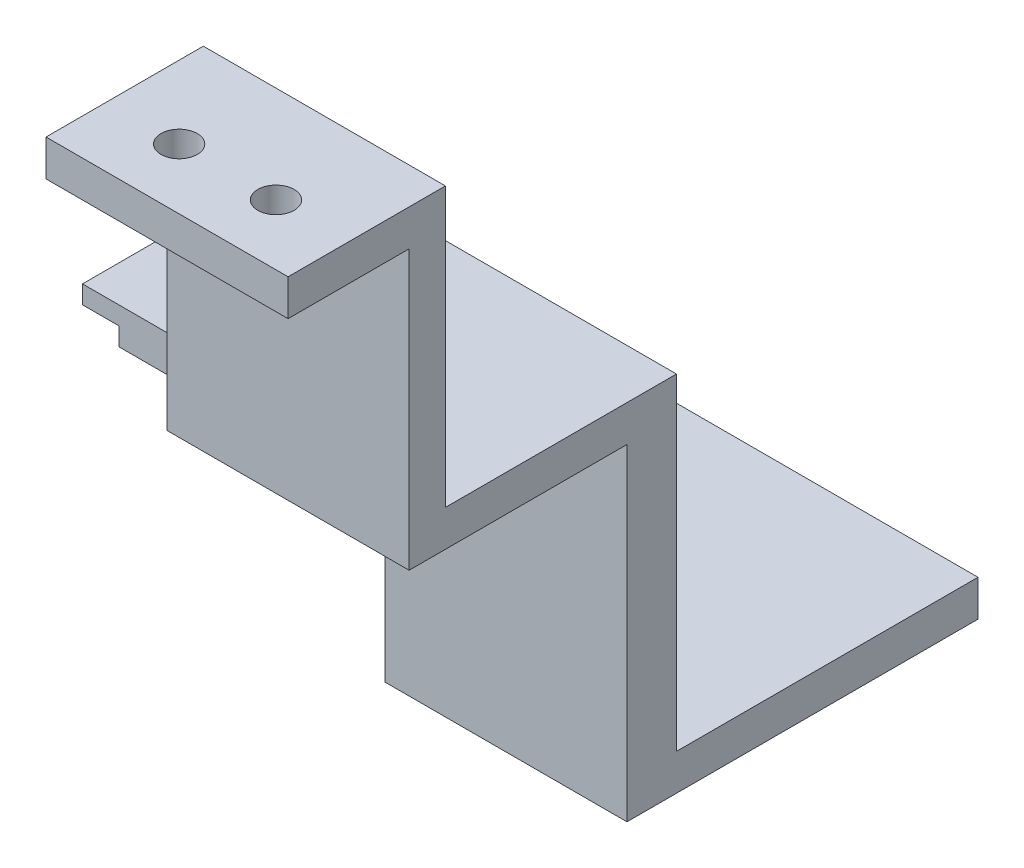
ISO-10303-21;
HEADER;
FILE_DESCRIPTION(('STEP AP214'),'2;1');
FILE_NAME('part.step','',(''),(''),'','','');
FILE_SCHEMA(('AUTOMOTIVE_DESIGN { 1 0 10303 214 1 1 1 1 }'));
ENDSEC;
DATA;
#1=APPLICATION_CONTEXT('core data for automotive mechanical design processes');
#2=APPLICATION_PROTOCOL_DEFINITION('international standard','automotive_design',2000,#1);
#3=PRODUCT_CONTEXT('',#1,'mechanical');
#4=PRODUCT('Part','Part','',(#3));
#5=PRODUCT_RELATED_PRODUCT_CATEGORY('part','',(#4));
#6=PRODUCT_DEFINITION_FORMATION('','',#4);
#7=PRODUCT_DEFINITION_CONTEXT('part definition',#1,'design');
#8=PRODUCT_DEFINITION('design','',#6,#7);
#9=PRODUCT_DEFINITION_SHAPE('','',#8);
#10=(LENGTH_UNIT() NAMED_UNIT(*) SI_UNIT(.MILLI.,.METRE.));
#11=(NAMED_UNIT(*) PLANE_ANGLE_UNIT() SI_UNIT($,.RADIAN.));
#12=(NAMED_UNIT(*) SI_UNIT($,.STERADIAN.) SOLID_ANGLE_UNIT());
#13=UNCERTAINTY_MEASURE_WITH_UNIT(LENGTH_MEASURE(1.E-05),#10,'distance_accuracy_value','');
#14=(GEOMETRIC_REPRESENTATION_CONTEXT(3) GLOBAL_UNCERTAINTY_ASSIGNED_CONTEXT((#13)) GLOBAL_UNIT_ASSIGNED_CONTEXT((#10,
#11,#12)) REPRESENTATION_CONTEXT('',''));
#15=CARTESIAN_POINT('',(0.,0.,0.));
#16=DIRECTION('',(0.,0.,1.));
#17=DIRECTION('',(1.,0.,0.));
#18=AXIS2_PLACEMENT_3D('',#15,#16,#17);
#19=CARTESIAN_POINT('',(9.99999999999999,-50.,-23.));
#20=DIRECTION('',(0.,-1.,0.));
#21=DIRECTION('',(0.,0.,-1.));
#22=AXIS2_PLACEMENT_3D('',#19,#20,#21);
#23=PLANE('',#22);
#24=DIRECTION('',(-1.,0.,0.));
#25=VECTOR('',#24,1.);
#26=CARTESIAN_POINT('',(-45.9839745962156,-50.,-36.));
#27=LINE('',#26,#25);
#28=CARTESIAN_POINT('',(-10.,-50.,-36.));
#29=VERTEX_POINT('',#28);
#30=CARTESIAN_POINT('',(-44.9839745962156,-50.,-36.));
#31=VERTEX_POINT('',#30);
#32=EDGE_CURVE('E184',#29,#31,#27,.T.);
#33=ORIENTED_EDGE('',*,*,#32,.T.);
#34=DIRECTION('',(0.,0.,1.));
#35=VECTOR('',#34,1.);
#36=CARTESIAN_POINT('',(-44.9839745962156,-50.,-52.));
#37=LINE('',#36,#35);
#38=CARTESIAN_POINT('',(-44.9839745962156,-50.,-52.));
#39=VERTEX_POINT('',#38);
#40=EDGE_CURVE('E172',#39,#31,#37,.T.);
#41=ORIENTED_EDGE('',*,*,#40,.F.);
#42=DIRECTION('',(1.,0.,0.));
#43=VECTOR('',#42,1.);
#44=CARTESIAN_POINT('',(-45.9839745962156,-50.,-52.));
#45=LINE('',#44,#43);
#46=CARTESIAN_POINT('',(9.99999999999996,-50.,-52.));
#47=VERTEX_POINT('',#46);
#48=EDGE_CURVE('E180',#39,#47,#45,.T.);
#49=ORIENTED_EDGE('',*,*,#48,.T.);
#50=DIRECTION('',(0.,0.,1.));
#51=VECTOR('',#50,1.);
#52=CARTESIAN_POINT('',(9.99999999999999,-50.,-23.));
#53=LINE('',#52,#51);
#54=CARTESIAN_POINT('',(9.99999999999999,-50.,-23.));
#55=VERTEX_POINT('',#54);
#56=EDGE_CURVE('E222',#47,#55,#53,.T.);
#57=ORIENTED_EDGE('',*,*,#56,.T.);
#58=DIRECTION('',(-1.,0.,0.));
#59=VECTOR('',#58,1.);
#60=CARTESIAN_POINT('',(9.99999999999999,-50.,-23.));
#61=LINE('',#60,#59);
#62=CARTESIAN_POINT('',(-10.,-50.,-23.));
#63=VERTEX_POINT('',#62);
#64=EDGE_CURVE('E257',#55,#63,#61,.T.);
#65=ORIENTED_EDGE('',*,*,#64,.T.);
#66=DIRECTION('',(0.,0.,1.));
#67=VECTOR('',#66,1.);
#68=CARTESIAN_POINT('',(-10.,-50.,-23.));
#69=LINE('',#68,#67);
#70=EDGE_CURVE('E243',#29,#63,#69,.T.);
#71=ORIENTED_EDGE('',*,*,#70,.F.);
#72=EDGE_LOOP('',(#33,#41,#49,#57,#65,#71));
#73=FACE_BOUND('',#72,.T.);
#74=ADVANCED_FACE('F35',(#73),#23,.T.);
#75=CARTESIAN_POINT('',(9.99999999999999,-47.,-44.));
#76=DIRECTION('',(0.,1.,0.));
#77=DIRECTION('',(0.,0.,1.));
#78=AXIS2_PLACEMENT_3D('',#75,#76,#77);
#79=PLANE('',#78);
#80=DIRECTION('',(1.,0.,0.));
#81=VECTOR('',#80,1.);
#82=CARTESIAN_POINT('',(-45.9839745962156,-47.,-52.));
#83=LINE('',#82,#81);
#84=CARTESIAN_POINT('',(-47.9839745962156,-47.,-52.));
#85=VERTEX_POINT('',#84);
#86=CARTESIAN_POINT('',(9.99999999999996,-47.,-52.));
#87=VERTEX_POINT('',#86);
#88=EDGE_CURVE('E181',#85,#87,#83,.T.);
#89=ORIENTED_EDGE('',*,*,#88,.F.);
#90=DIRECTION('',(0.,0.,-1.));
#91=VECTOR('',#90,1.);
#92=CARTESIAN_POINT('',(-47.9839745962156,-47.,-52.));
#93=LINE('',#92,#91);
#94=CARTESIAN_POINT('',(-47.9839745962156,-47.,-36.));
#95=VERTEX_POINT('',#94);
#96=EDGE_CURVE('E165',#95,#85,#93,.T.);
#97=ORIENTED_EDGE('',*,*,#96,.F.);
#98=DIRECTION('',(-1.,0.,0.));
#99=VECTOR('',#98,1.);
#100=CARTESIAN_POINT('',(-45.9839745962156,-47.,-36.));
#101=LINE('',#100,#99);
#102=CARTESIAN_POINT('',(-10.,-47.,-36.));
#103=VERTEX_POINT('',#102);
#104=EDGE_CURVE('E183',#103,#95,#101,.T.);
#105=ORIENTED_EDGE('',*,*,#104,.F.);
#106=DIRECTION('',(0.,0.,-1.));
#107=VECTOR('',#106,1.);
#108=CARTESIAN_POINT('',(-10.,-47.,-44.));
#109=LINE('',#108,#107);
#110=CARTESIAN_POINT('',(-10.,-47.,-27.0877784990879));
#111=VERTEX_POINT('',#110);
#112=EDGE_CURVE('E241',#111,#103,#109,.T.);
#113=ORIENTED_EDGE('',*,*,#112,.F.);
#114=DIRECTION('',(-1.,0.,0.));
#115=VECTOR('',#114,1.);
#116=CARTESIAN_POINT('',(9.99999999999999,-47.,-27.0877784990879));
#117=LINE('',#116,#115);
#118=CARTESIAN_POINT('',(9.99999999999999,-47.,-27.0877784990879));
#119=VERTEX_POINT('',#118);
#120=EDGE_CURVE('E260',#119,#111,#117,.T.);
#121=ORIENTED_EDGE('',*,*,#120,.F.);
#122=DIRECTION('',(0.,0.,-1.));
#123=VECTOR('',#122,1.);
#124=CARTESIAN_POINT('',(9.99999999999999,-47.,-44.));
#125=LINE('',#124,#123);
#126=EDGE_CURVE('E219',#119,#87,#125,.T.);
#127=ORIENTED_EDGE('',*,*,#126,.T.);
#128=EDGE_LOOP('',(#89,#97,#105,#113,#121,#127));
#129=FACE_BOUND('',#128,.T.);
#130=ADVANCED_FACE('F312',(#129),#79,.T.);
#131=CARTESIAN_POINT('',(-45.9839745962156,-47.,-36.));
#132=DIRECTION('',(0.,0.,1.));
#133=DIRECTION('',(1.,0.,0.));
#134=AXIS2_PLACEMENT_3D('',#131,#132,#133);
#135=PLANE('',#134);
#136=ORIENTED_EDGE('',*,*,#104,.T.);
#137=DIRECTION('',(0.,1.,0.));
#138=VECTOR('',#137,1.);
#139=CARTESIAN_POINT('',(-47.9839745962156,-47.,-36.));
#140=LINE('',#139,#138);
#141=CARTESIAN_POINT('',(-47.9839745962156,-48.5,-36.));
#142=VERTEX_POINT('',#141);
#143=EDGE_CURVE('E158',#142,#95,#140,.T.);
#144=ORIENTED_EDGE('',*,*,#143,.F.);
#145=DIRECTION('',(1.,0.,0.));
#146=VECTOR('',#145,1.);
#147=CARTESIAN_POINT('',(-47.9839745962156,-48.5,-36.));
#148=LINE('',#147,#146);
#149=CARTESIAN_POINT('',(-44.9839745962156,-48.5,-36.));
#150=VERTEX_POINT('',#149);
#151=EDGE_CURVE('E154',#142,#150,#148,.T.);
#152=ORIENTED_EDGE('',*,*,#151,.T.);
#153=DIRECTION('',(0.,1.,0.));
#154=VECTOR('',#153,1.);
#155=CARTESIAN_POINT('',(-44.9839745962156,-47.,-36.));
#156=LINE('',#155,#154);
#157=EDGE_CURVE('E178',#31,#150,#156,.T.);
#158=ORIENTED_EDGE('',*,*,#157,.F.);
#159=ORIENTED_EDGE('',*,*,#32,.F.);
#160=DIRECTION('',(0.,-1.,0.));
#161=VECTOR('',#160,1.);
#162=CARTESIAN_POINT('',(-10.,3.,-36.));
#163=LINE('',#162,#161);
#164=EDGE_CURVE('E58',#103,#29,#163,.T.);
#165=ORIENTED_EDGE('',*,*,#164,.F.);
#166=EDGE_LOOP('',(#136,#144,#152,#158,#159,#165));
#167=FACE_BOUND('',#166,.T.);
#168=ADVANCED_FACE('F332',(#167),#135,.T.);
#169=CARTESIAN_POINT('',(-45.9839745962156,-47.,-52.));
#170=DIRECTION('',(0.,0.,-1.));
#171=DIRECTION('',(-1.,0.,0.));
#172=AXIS2_PLACEMENT_3D('',#169,#170,#171);
#173=PLANE('',#172);
#174=ORIENTED_EDGE('',*,*,#48,.F.);
#175=DIRECTION('',(0.,-1.,0.));
#176=VECTOR('',#175,1.);
#177=CARTESIAN_POINT('',(-44.9839745962156,-47.,-52.));
#178=LINE('',#177,#176);
#179=CARTESIAN_POINT('',(-44.9839745962156,-48.5,-52.));
#180=VERTEX_POINT('',#179);
#181=EDGE_CURVE('E170',#180,#39,#178,.T.);
#182=ORIENTED_EDGE('',*,*,#181,.F.);
#183=DIRECTION('',(1.,0.,0.));
#184=VECTOR('',#183,1.);
#185=CARTESIAN_POINT('',(-47.9839745962156,-48.5,-52.));
#186=LINE('',#185,#184);
#187=CARTESIAN_POINT('',(-47.9839745962156,-48.5,-52.));
#188=VERTEX_POINT('',#187);
#189=EDGE_CURVE('E152',#188,#180,#186,.T.);
#190=ORIENTED_EDGE('',*,*,#189,.F.);
#191=DIRECTION('',(0.,-1.,0.));
#192=VECTOR('',#191,1.);
#193=CARTESIAN_POINT('',(-47.9839745962156,-47.,-52.));
#194=LINE('',#193,#192);
#195=EDGE_CURVE('E159',#85,#188,#194,.T.);
#196=ORIENTED_EDGE('',*,*,#195,.F.);
#197=ORIENTED_EDGE('',*,*,#88,.T.);
#198=DIRECTION('',(0.,-1.,0.));
#199=VECTOR('',#198,1.);
#200=CARTESIAN_POINT('',(9.99999999999996,-47.,-52.));
#201=LINE('',#200,#199);
#202=EDGE_CURVE('E186',#87,#47,#201,.T.);
#203=ORIENTED_EDGE('',*,*,#202,.T.);
#204=EDGE_LOOP('',(#174,#182,#190,#196,#197,#203));
#205=FACE_BOUND('',#204,.T.);
#206=ADVANCED_FACE('F169',(#205),#173,.T.);
#207=CARTESIAN_POINT('',(9.99999999999999,3.,-5.));
#208=DIRECTION('',(-1.,0.,0.));
#209=DIRECTION('',(0.,0.,1.));
#210=AXIS2_PLACEMENT_3D('',#207,#208,#209);
#211=PLANE('',#210);
#212=DIRECTION('',(0.,1.,0.));
#213=VECTOR('',#212,1.);
#214=CARTESIAN_POINT('',(9.99999999999999,-23.0000000000001,-23.));
#215=LINE('',#214,#213);
#216=CARTESIAN_POINT('',(9.99999999999999,-23.0000000000001,-23.));
#217=VERTEX_POINT('',#216);
#218=EDGE_CURVE('E224',#55,#217,#215,.T.);
#219=ORIENTED_EDGE('',*,*,#218,.F.);
#220=ORIENTED_EDGE('',*,*,#56,.F.);
#221=ORIENTED_EDGE('',*,*,#202,.F.);
#222=ORIENTED_EDGE('',*,*,#126,.F.);
#223=DIRECTION('',(0.,-1.,0.));
#224=VECTOR('',#223,1.);
#225=CARTESIAN_POINT('',(9.99999999999999,-20.0000000000001,-27.0877784990879));
#226=LINE('',#225,#224);
#227=CARTESIAN_POINT('',(9.99999999999999,-20.0000000000001,-27.0877784990879));
#228=VERTEX_POINT('',#227);
#229=EDGE_CURVE('E216',#228,#119,#226,.T.);
#230=ORIENTED_EDGE('',*,*,#229,.F.);
#231=DIRECTION('',(0.,0.,-1.));
#232=VECTOR('',#231,1.);
#233=CARTESIAN_POINT('',(9.99999999999999,-20.0000000000001,-27.0877784990879));
#234=LINE('',#233,#232);
#235=CARTESIAN_POINT('',(9.99999999999999,-20.0000000000001,-8.00000000002824));
#236=VERTEX_POINT('',#235);
#237=EDGE_CURVE('E213',#236,#228,#234,.T.);
#238=ORIENTED_EDGE('',*,*,#237,.F.);
#239=DIRECTION('',(0.,-1.,0.));
#240=VECTOR('',#239,1.);
#241=CARTESIAN_POINT('',(9.99999999999999,-20.0000000000001,-8.00000000002824));
#242=LINE('',#241,#240);
#243=CARTESIAN_POINT('',(9.99999999999999,2.99999999999989,-8.00000000002824));
#244=VERTEX_POINT('',#243);
#245=EDGE_CURVE('E209',#244,#236,#242,.T.);
#246=ORIENTED_EDGE('',*,*,#245,.F.);
#247=DIRECTION('',(0.,0.,-1.));
#248=VECTOR('',#247,1.);
#249=CARTESIAN_POINT('',(9.99999999999999,3.,-5.));
#250=LINE('',#249,#248);
#251=CARTESIAN_POINT('',(10.,3.,5.));
#252=VERTEX_POINT('',#251);
#253=EDGE_CURVE('E268',#252,#244,#250,.T.);
#254=ORIENTED_EDGE('',*,*,#253,.F.);
#255=DIRECTION('',(0.,-1.,0.));
#256=VECTOR('',#255,1.);
#257=CARTESIAN_POINT('',(10.,3.,5.));
#258=LINE('',#257,#256);
#259=CARTESIAN_POINT('',(10.,0.,5.));
#260=VERTEX_POINT('',#259);
#261=EDGE_CURVE('E43',#252,#260,#258,.T.);
#262=ORIENTED_EDGE('',*,*,#261,.T.);
#263=DIRECTION('',(0.,0.,-1.));
#264=VECTOR('',#263,1.);
#265=CARTESIAN_POINT('',(9.99999999999999,0.,-5.));
#266=LINE('',#265,#264);
#267=CARTESIAN_POINT('',(9.99999999999999,0.,-5.));
#268=VERTEX_POINT('',#267);
#269=EDGE_CURVE('E253',#260,#268,#266,.T.);
#270=ORIENTED_EDGE('',*,*,#269,.T.);
#271=DIRECTION('',(0.,1.,0.));
#272=VECTOR('',#271,1.);
#273=CARTESIAN_POINT('',(9.99999999999999,-23.0000000000001,-5.));
#274=LINE('',#273,#272);
#275=CARTESIAN_POINT('',(9.99999999999999,-23.0000000000001,-5.));
#276=VERTEX_POINT('',#275);
#277=EDGE_CURVE('E206',#276,#268,#274,.T.);
#278=ORIENTED_EDGE('',*,*,#277,.F.);
#279=DIRECTION('',(0.,0.,1.));
#280=VECTOR('',#279,1.);
#281=CARTESIAN_POINT('',(9.99999999999999,-23.0000000000001,-8.00000000002819));
#282=LINE('',#281,#280);
#283=EDGE_CURVE('E227',#217,#276,#282,.T.);
#284=ORIENTED_EDGE('',*,*,#283,.F.);
#285=EDGE_LOOP('',(#219,#220,#221,#222,#230,#238,#246,#254,#262,#270,#278,#284));
#286=FACE_BOUND('',#285,.T.);
#287=ADVANCED_FACE('F37',(#286),#211,.F.);
#288=CARTESIAN_POINT('',(-10.,3.,-5.));
#289=DIRECTION('',(1.,0.,0.));
#290=DIRECTION('',(0.,0.,-1.));
#291=AXIS2_PLACEMENT_3D('',#288,#289,#290);
#292=PLANE('',#291);
#293=ORIENTED_EDGE('',*,*,#112,.T.);
#294=ORIENTED_EDGE('',*,*,#164,.T.);
#295=ORIENTED_EDGE('',*,*,#70,.T.);
#296=DIRECTION('',(0.,1.,0.));
#297=VECTOR('',#296,1.);
#298=CARTESIAN_POINT('',(-10.,-23.0000000000001,-23.));
#299=LINE('',#298,#297);
#300=CARTESIAN_POINT('',(-10.,-23.0000000000001,-23.));
#301=VERTEX_POINT('',#300);
#302=EDGE_CURVE('E245',#63,#301,#299,.T.);
#303=ORIENTED_EDGE('',*,*,#302,.T.);
#304=DIRECTION('',(0.,0.,1.));
#305=VECTOR('',#304,1.);
#306=CARTESIAN_POINT('',(-10.,-23.0000000000001,-8.00000000002819));
#307=LINE('',#306,#305);
#308=CARTESIAN_POINT('',(-10.,-23.0000000000001,-5.));
#309=VERTEX_POINT('',#308);
#310=EDGE_CURVE('E210',#301,#309,#307,.T.);
#311=ORIENTED_EDGE('',*,*,#310,.T.);
#312=DIRECTION('',(0.,1.,0.));
#313=VECTOR('',#312,1.);
#314=CARTESIAN_POINT('',(-10.,3.,-5.));
#315=LINE('',#314,#313);
#316=CARTESIAN_POINT('',(-10.,0.,-5.));
#317=VERTEX_POINT('',#316);
#318=EDGE_CURVE('E201',#309,#317,#315,.T.);
#319=ORIENTED_EDGE('',*,*,#318,.T.);
#320=DIRECTION('',(0.,0.,1.));
#321=VECTOR('',#320,1.);
#322=CARTESIAN_POINT('',(-10.,0.,-5.));
#323=LINE('',#322,#321);
#324=CARTESIAN_POINT('',(-10.,0.,5.));
#325=VERTEX_POINT('',#324);
#326=EDGE_CURVE('E280',#317,#325,#323,.T.);
#327=ORIENTED_EDGE('',*,*,#326,.T.);
#328=DIRECTION('',(0.,-1.,0.));
#329=VECTOR('',#328,1.);
#330=CARTESIAN_POINT('',(-10.,3.,5.));
#331=LINE('',#330,#329);
#332=CARTESIAN_POINT('',(-10.,3.,5.));
#333=VERTEX_POINT('',#332);
#334=EDGE_CURVE('E11',#333,#325,#331,.T.);
#335=ORIENTED_EDGE('',*,*,#334,.F.);
#336=DIRECTION('',(0.,0.,1.));
#337=VECTOR('',#336,1.);
#338=CARTESIAN_POINT('',(-10.,3.,-5.));
#339=LINE('',#338,#337);
#340=CARTESIAN_POINT('',(-10.,2.99999999999989,-8.00000000002823));
#341=VERTEX_POINT('',#340);
#342=EDGE_CURVE('E270',#341,#333,#339,.T.);
#343=ORIENTED_EDGE('',*,*,#342,.F.);
#344=DIRECTION('',(0.,-1.,0.));
#345=VECTOR('',#344,1.);
#346=CARTESIAN_POINT('',(-10.,-20.0000000000001,-8.00000000002823));
#347=LINE('',#346,#345);
#348=CARTESIAN_POINT('',(-10.,-20.0000000000001,-8.00000000002823));
#349=VERTEX_POINT('',#348);
#350=EDGE_CURVE('E232',#341,#349,#347,.T.);
#351=ORIENTED_EDGE('',*,*,#350,.T.);
#352=DIRECTION('',(0.,0.,-1.));
#353=VECTOR('',#352,1.);
#354=CARTESIAN_POINT('',(-10.,-20.0000000000001,-27.0877784990879));
#355=LINE('',#354,#353);
#356=CARTESIAN_POINT('',(-10.,-20.0000000000001,-27.0877784990879));
#357=VERTEX_POINT('',#356);
#358=EDGE_CURVE('E235',#349,#357,#355,.T.);
#359=ORIENTED_EDGE('',*,*,#358,.T.);
#360=DIRECTION('',(0.,-1.,0.));
#361=VECTOR('',#360,1.);
#362=CARTESIAN_POINT('',(-10.,-20.0000000000001,-27.0877784990879));
#363=LINE('',#362,#361);
#364=EDGE_CURVE('E238',#357,#111,#363,.T.);
#365=ORIENTED_EDGE('',*,*,#364,.T.);
#366=EDGE_LOOP('',(#293,#294,#295,#303,#311,#319,#327,#335,#343,#351,#359,#365));
#367=FACE_BOUND('',#366,.T.);
#368=ADVANCED_FACE('F298',(#367),#292,.F.);
#369=CARTESIAN_POINT('',(-10.,3.,5.));
#370=DIRECTION('',(0.,0.,-1.));
#371=DIRECTION('',(-1.,0.,0.));
#372=AXIS2_PLACEMENT_3D('',#369,#370,#371);
#373=PLANE('',#372);
#374=DIRECTION('',(1.,0.,0.));
#375=VECTOR('',#374,1.);
#376=CARTESIAN_POINT('',(-10.,0.,5.));
#377=LINE('',#376,#375);
#378=EDGE_CURVE('E271',#325,#260,#377,.T.);
#379=ORIENTED_EDGE('',*,*,#378,.T.);
#380=ORIENTED_EDGE('',*,*,#261,.F.);
#381=DIRECTION('',(1.,0.,0.));
#382=VECTOR('',#381,1.);
#383=CARTESIAN_POINT('',(-10.,3.,5.));
#384=LINE('',#383,#382);
#385=EDGE_CURVE('E273',#333,#252,#384,.T.);
#386=ORIENTED_EDGE('',*,*,#385,.F.);
#387=ORIENTED_EDGE('',*,*,#334,.T.);
#388=EDGE_LOOP('',(#379,#380,#386,#387));
#389=FACE_BOUND('',#388,.T.);
#390=ADVANCED_FACE('F328',(#389),#373,.F.);
#391=CARTESIAN_POINT('',(0.,3.,0.));
#392=DIRECTION('',(0.,1.,0.));
#393=DIRECTION('',(0.,0.,1.));
#394=AXIS2_PLACEMENT_3D('',#391,#392,#393);
#395=PLANE('',#394);
#396=CARTESIAN_POINT('',(4.,3.,0.));
#397=DIRECTION('',(0.,1.,0.));
#398=DIRECTION('',(0.,0.,1.));
#399=AXIS2_PLACEMENT_3D('',#396,#397,#398);
#400=CIRCLE('',#399,1.5);
#401=CARTESIAN_POINT('',(4.,3.,1.5));
#402=VERTEX_POINT('',#401);
#403=EDGE_CURVE('E194',#402,#402,#400,.T.);
#404=ORIENTED_EDGE('',*,*,#403,.F.);
#405=EDGE_LOOP('',(#404));
#406=FACE_BOUND('',#405,.T.);
#407=CARTESIAN_POINT('',(-4.,3.,0.));
#408=DIRECTION('',(0.,1.,0.));
#409=DIRECTION('',(0.,0.,1.));
#410=AXIS2_PLACEMENT_3D('',#407,#408,#409);
#411=CIRCLE('',#410,1.5);
#412=CARTESIAN_POINT('',(-4.,3.,1.5));
#413=VERTEX_POINT('',#412);
#414=EDGE_CURVE('E193',#413,#413,#411,.T.);
#415=ORIENTED_EDGE('',*,*,#414,.F.);
#416=EDGE_LOOP('',(#415));
#417=FACE_BOUND('',#416,.T.);
#418=ORIENTED_EDGE('',*,*,#253,.T.);
#419=DIRECTION('',(-1.,0.,0.));
#420=VECTOR('',#419,1.);
#421=CARTESIAN_POINT('',(9.99999999999999,2.99999999999989,-8.00000000002824));
#422=LINE('',#421,#420);
#423=EDGE_CURVE('E229',#244,#341,#422,.T.);
#424=ORIENTED_EDGE('',*,*,#423,.T.);
#425=ORIENTED_EDGE('',*,*,#342,.T.);
#426=ORIENTED_EDGE('',*,*,#385,.T.);
#427=EDGE_LOOP('',(#418,#424,#425,#426));
#428=FACE_BOUND('',#427,.T.);
#429=ADVANCED_FACE('F327',(#406,#417,#428),#395,.T.);
#430=CARTESIAN_POINT('',(0.,0.,0.));
#431=DIRECTION('',(0.,1.,0.));
#432=DIRECTION('',(0.,0.,1.));
#433=AXIS2_PLACEMENT_3D('',#430,#431,#432);
#434=PLANE('',#433);
#435=CARTESIAN_POINT('',(4.,0.,0.));
#436=DIRECTION('',(0.,1.,0.));
#437=DIRECTION('',(0.,0.,1.));
#438=AXIS2_PLACEMENT_3D('',#435,#436,#437);
#439=CIRCLE('',#438,1.5);
#440=CARTESIAN_POINT('',(4.,0.,1.5));
#441=VERTEX_POINT('',#440);
#442=EDGE_CURVE('E197',#441,#441,#439,.F.);
#443=ORIENTED_EDGE('',*,*,#442,.F.);
#444=EDGE_LOOP('',(#443));
#445=FACE_BOUND('',#444,.T.);
#446=CARTESIAN_POINT('',(-4.,0.,0.));
#447=DIRECTION('',(0.,1.,0.));
#448=DIRECTION('',(0.,0.,1.));
#449=AXIS2_PLACEMENT_3D('',#446,#447,#448);
#450=CIRCLE('',#449,1.5);
#451=CARTESIAN_POINT('',(-4.,0.,1.5));
#452=VERTEX_POINT('',#451);
#453=EDGE_CURVE('E198',#452,#452,#450,.F.);
#454=ORIENTED_EDGE('',*,*,#453,.F.);
#455=EDGE_LOOP('',(#454));
#456=FACE_BOUND('',#455,.T.);
#457=ORIENTED_EDGE('',*,*,#269,.F.);
#458=ORIENTED_EDGE('',*,*,#378,.F.);
#459=ORIENTED_EDGE('',*,*,#326,.F.);
#460=DIRECTION('',(-1.,0.,0.));
#461=VECTOR('',#460,1.);
#462=CARTESIAN_POINT('',(-10.,0.,-5.));
#463=LINE('',#462,#461);
#464=EDGE_CURVE('E277',#268,#317,#463,.T.);
#465=ORIENTED_EDGE('',*,*,#464,.F.);
#466=EDGE_LOOP('',(#457,#458,#459,#465));
#467=FACE_BOUND('',#466,.T.);
#468=ADVANCED_FACE('F294',(#445,#456,#467),#434,.F.);
#469=CARTESIAN_POINT('',(9.99999999999999,-23.0000000000001,-8.00000000002819));
#470=DIRECTION('',(0.,-1.,0.));
#471=DIRECTION('',(0.,0.,-1.));
#472=AXIS2_PLACEMENT_3D('',#469,#470,#471);
#473=PLANE('',#472);
#474=ORIENTED_EDGE('',*,*,#310,.F.);
#475=DIRECTION('',(-1.,0.,0.));
#476=VECTOR('',#475,1.);
#477=CARTESIAN_POINT('',(9.99999999999999,-23.0000000000001,-23.));
#478=LINE('',#477,#476);
#479=EDGE_CURVE('E254',#217,#301,#478,.T.);
#480=ORIENTED_EDGE('',*,*,#479,.F.);
#481=ORIENTED_EDGE('',*,*,#283,.T.);
#482=DIRECTION('',(-1.,0.,0.));
#483=VECTOR('',#482,1.);
#484=CARTESIAN_POINT('',(9.99999999999999,-23.0000000000001,-5.));
#485=LINE('',#484,#483);
#486=EDGE_CURVE('E250',#276,#309,#485,.T.);
#487=ORIENTED_EDGE('',*,*,#486,.T.);
#488=EDGE_LOOP('',(#474,#480,#481,#487));
#489=FACE_BOUND('',#488,.T.);
#490=ADVANCED_FACE('F302',(#489),#473,.T.);
#491=CARTESIAN_POINT('',(9.99999999999999,-23.0000000000001,-23.));
#492=DIRECTION('',(0.,0.,1.));
#493=DIRECTION('',(1.,0.,0.));
#494=AXIS2_PLACEMENT_3D('',#491,#492,#493);
#495=PLANE('',#494);
#496=ORIENTED_EDGE('',*,*,#302,.F.);
#497=ORIENTED_EDGE('',*,*,#64,.F.);
#498=ORIENTED_EDGE('',*,*,#218,.T.);
#499=ORIENTED_EDGE('',*,*,#479,.T.);
#500=EDGE_LOOP('',(#496,#497,#498,#499));
#501=FACE_BOUND('',#500,.T.);
#502=ADVANCED_FACE('F305',(#501),#495,.T.);
#503=CARTESIAN_POINT('',(9.99999999999999,-20.0000000000001,-27.0877784990879));
#504=DIRECTION('',(0.,0.,-1.));
#505=DIRECTION('',(-1.,0.,0.));
#506=AXIS2_PLACEMENT_3D('',#503,#504,#505);
#507=PLANE('',#506);
#508=ORIENTED_EDGE('',*,*,#364,.F.);
#509=DIRECTION('',(-1.,0.,0.));
#510=VECTOR('',#509,1.);
#511=CARTESIAN_POINT('',(9.99999999999999,-20.0000000000001,-27.0877784990879));
#512=LINE('',#511,#510);
#513=EDGE_CURVE('E262',#228,#357,#512,.T.);
#514=ORIENTED_EDGE('',*,*,#513,.F.);
#515=ORIENTED_EDGE('',*,*,#229,.T.);
#516=ORIENTED_EDGE('',*,*,#120,.T.);
#517=EDGE_LOOP('',(#508,#514,#515,#516));
#518=FACE_BOUND('',#517,.T.);
#519=ADVANCED_FACE('F318',(#518),#507,.T.);
#520=CARTESIAN_POINT('',(9.99999999999999,-20.0000000000001,-27.0877784990879));
#521=DIRECTION('',(0.,1.,0.));
#522=DIRECTION('',(0.,0.,1.));
#523=AXIS2_PLACEMENT_3D('',#520,#521,#522);
#524=PLANE('',#523);
#525=ORIENTED_EDGE('',*,*,#358,.F.);
#526=DIRECTION('',(-1.,0.,0.));
#527=VECTOR('',#526,1.);
#528=CARTESIAN_POINT('',(9.99999999999999,-20.0000000000001,-8.00000000002824));
#529=LINE('',#528,#527);
#530=EDGE_CURVE('E264',#236,#349,#529,.T.);
#531=ORIENTED_EDGE('',*,*,#530,.F.);
#532=ORIENTED_EDGE('',*,*,#237,.T.);
#533=ORIENTED_EDGE('',*,*,#513,.T.);
#534=EDGE_LOOP('',(#525,#531,#532,#533));
#535=FACE_BOUND('',#534,.T.);
#536=ADVANCED_FACE('F321',(#535),#524,.T.);
#537=CARTESIAN_POINT('',(9.99999999999999,-20.0000000000001,-8.00000000002824));
#538=DIRECTION('',(0.,0.,-1.));
#539=DIRECTION('',(-1.,0.,0.));
#540=AXIS2_PLACEMENT_3D('',#537,#538,#539);
#541=PLANE('',#540);
#542=ORIENTED_EDGE('',*,*,#350,.F.);
#543=ORIENTED_EDGE('',*,*,#423,.F.);
#544=ORIENTED_EDGE('',*,*,#245,.T.);
#545=ORIENTED_EDGE('',*,*,#530,.T.);
#546=EDGE_LOOP('',(#542,#543,#544,#545));
#547=FACE_BOUND('',#546,.T.);
#548=ADVANCED_FACE('F325',(#547),#541,.T.);
#549=CARTESIAN_POINT('',(9.99999999999999,3.,-5.));
#550=DIRECTION('',(0.,0.,1.));
#551=DIRECTION('',(1.,0.,0.));
#552=AXIS2_PLACEMENT_3D('',#549,#550,#551);
#553=PLANE('',#552);
#554=ORIENTED_EDGE('',*,*,#277,.T.);
#555=ORIENTED_EDGE('',*,*,#464,.T.);
#556=ORIENTED_EDGE('',*,*,#318,.F.);
#557=ORIENTED_EDGE('',*,*,#486,.F.);
#558=EDGE_LOOP('',(#554,#555,#556,#557));
#559=FACE_BOUND('',#558,.T.);
#560=ADVANCED_FACE('F296',(#559),#553,.T.);
#561=CARTESIAN_POINT('',(-4.,-50.001,0.));
#562=DIRECTION('',(0.,1.,0.));
#563=DIRECTION('',(0.,0.,1.));
#564=AXIS2_PLACEMENT_3D('',#561,#562,#563);
#565=CYLINDRICAL_SURFACE('',#564,1.5);
#566=ORIENTED_EDGE('',*,*,#414,.T.);
#567=EDGE_LOOP('',(#566));
#568=FACE_BOUND('',#567,.T.);
#569=ORIENTED_EDGE('',*,*,#453,.T.);
#570=EDGE_LOOP('',(#569));
#571=FACE_BOUND('',#570,.T.);
#572=ADVANCED_FACE('F346',(#568,#571),#565,.F.);
#573=CARTESIAN_POINT('',(4.,-50.001,0.));
#574=DIRECTION('',(0.,1.,0.));
#575=DIRECTION('',(0.,0.,1.));
#576=AXIS2_PLACEMENT_3D('',#573,#574,#575);
#577=CYLINDRICAL_SURFACE('',#576,1.5);
#578=ORIENTED_EDGE('',*,*,#403,.T.);
#579=EDGE_LOOP('',(#578));
#580=FACE_BOUND('',#579,.T.);
#581=ORIENTED_EDGE('',*,*,#442,.T.);
#582=EDGE_LOOP('',(#581));
#583=FACE_BOUND('',#582,.T.);
#584=ADVANCED_FACE('F339',(#580,#583),#577,.F.);
#585=CARTESIAN_POINT('',(-44.9839745962156,0.,0.));
#586=DIRECTION('',(-1.,0.,0.));
#587=DIRECTION('',(0.,0.,1.));
#588=AXIS2_PLACEMENT_3D('',#585,#586,#587);
#589=PLANE('',#588);
#590=DIRECTION('',(0.,0.,1.));
#591=VECTOR('',#590,1.);
#592=CARTESIAN_POINT('',(-44.9839745962156,-48.5,-52.));
#593=LINE('',#592,#591);
#594=EDGE_CURVE('E50',#180,#150,#593,.T.);
#595=ORIENTED_EDGE('',*,*,#594,.F.);
#596=ORIENTED_EDGE('',*,*,#181,.T.);
#597=ORIENTED_EDGE('',*,*,#40,.T.);
#598=ORIENTED_EDGE('',*,*,#157,.T.);
#599=EDGE_LOOP('',(#595,#596,#597,#598));
#600=FACE_BOUND('',#599,.T.);
#601=ADVANCED_FACE('F337',(#600),#589,.T.);
#602=CARTESIAN_POINT('',(-47.9839745962156,-48.5,-52.));
#603=DIRECTION('',(0.,1.,0.));
#604=DIRECTION('',(0.,0.,1.));
#605=AXIS2_PLACEMENT_3D('',#602,#603,#604);
#606=PLANE('',#605);
#607=ORIENTED_EDGE('',*,*,#594,.T.);
#608=ORIENTED_EDGE('',*,*,#151,.F.);
#609=DIRECTION('',(0.,0.,1.));
#610=VECTOR('',#609,1.);
#611=CARTESIAN_POINT('',(-47.9839745962156,-48.5,-52.));
#612=LINE('',#611,#610);
#613=EDGE_CURVE('E148',#188,#142,#612,.T.);
#614=ORIENTED_EDGE('',*,*,#613,.F.);
#615=ORIENTED_EDGE('',*,*,#189,.T.);
#616=EDGE_LOOP('',(#607,#608,#614,#615));
#617=FACE_BOUND('',#616,.T.);
#618=ADVANCED_FACE('F150',(#617),#606,.F.);
#619=CARTESIAN_POINT('',(-47.9839745962156,0.,0.));
#620=DIRECTION('',(-1.,0.,0.));
#621=DIRECTION('',(0.,0.,1.));
#622=AXIS2_PLACEMENT_3D('',#619,#620,#621);
#623=PLANE('',#622);
#624=ORIENTED_EDGE('',*,*,#195,.T.);
#625=ORIENTED_EDGE('',*,*,#613,.T.);
#626=ORIENTED_EDGE('',*,*,#143,.T.);
#627=ORIENTED_EDGE('',*,*,#96,.T.);
#628=EDGE_LOOP('',(#624,#625,#626,#627));
#629=FACE_BOUND('',#628,.T.);
#630=ADVANCED_FACE('F163',(#629),#623,.T.);
#631=CLOSED_SHELL('',(#74,#130,#168,#206,#287,#368,#390,#429,#468,#490,#502,#519,#536,#548,#560,
#572,#584,#601,#618,#630));
#632=MANIFOLD_SOLID_BREP('B2',#631);
#633=ADVANCED_BREP_SHAPE_REPRESENTATION('',(#18,#632),#14);
#634=SHAPE_DEFINITION_REPRESENTATION(#9,#633);
ENDSEC;
END-ISO-10303-21;
